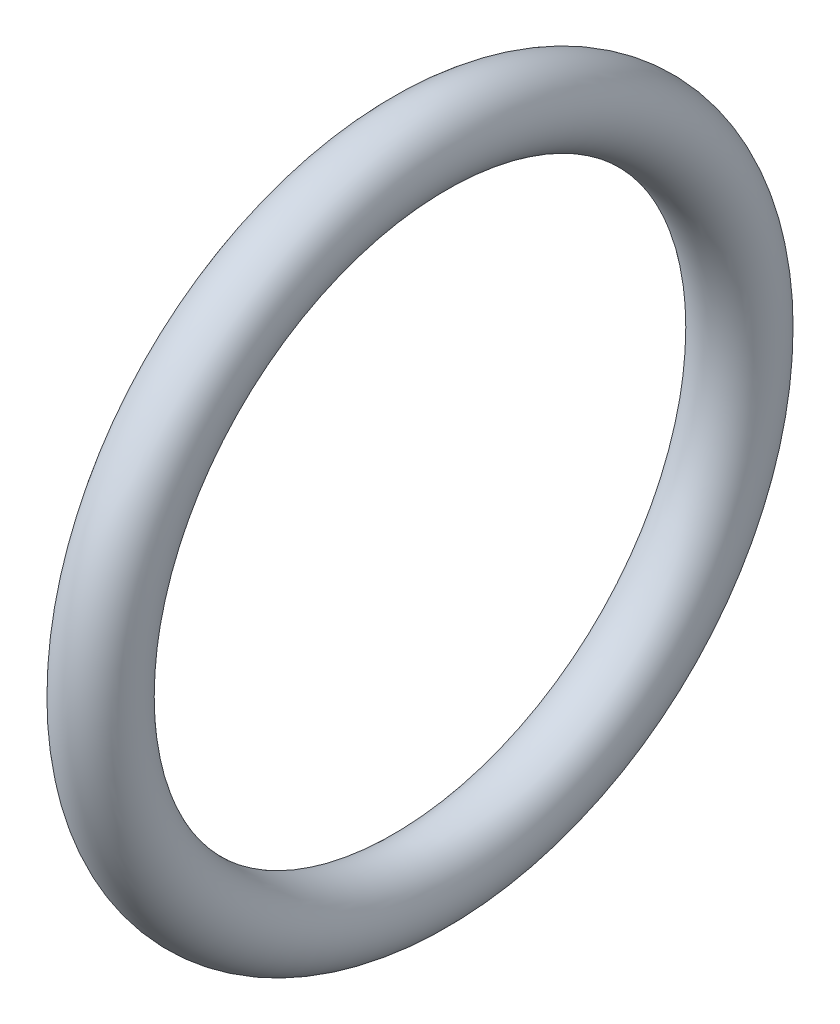
ISO-10303-21;
HEADER;
FILE_DESCRIPTION(('STEP AP214'),'2;1');
FILE_NAME('part.step','',(''),(''),'','','');
FILE_SCHEMA(('AUTOMOTIVE_DESIGN { 1 0 10303 214 1 1 1 1 }'));
ENDSEC;
DATA;
#1=APPLICATION_CONTEXT('core data for automotive mechanical design processes');
#2=APPLICATION_PROTOCOL_DEFINITION('international standard','automotive_design',2000,#1);
#3=PRODUCT_CONTEXT('',#1,'mechanical');
#4=PRODUCT('Part','Part','',(#3));
#5=PRODUCT_RELATED_PRODUCT_CATEGORY('part','',(#4));
#6=PRODUCT_DEFINITION_FORMATION('','',#4);
#7=PRODUCT_DEFINITION_CONTEXT('part definition',#1,'design');
#8=PRODUCT_DEFINITION('design','',#6,#7);
#9=PRODUCT_DEFINITION_SHAPE('','',#8);
#10=(LENGTH_UNIT() NAMED_UNIT(*) SI_UNIT(.MILLI.,.METRE.));
#11=(NAMED_UNIT(*) PLANE_ANGLE_UNIT() SI_UNIT($,.RADIAN.));
#12=(NAMED_UNIT(*) SI_UNIT($,.STERADIAN.) SOLID_ANGLE_UNIT());
#13=UNCERTAINTY_MEASURE_WITH_UNIT(LENGTH_MEASURE(1.E-05),#10,'distance_accuracy_value','');
#14=(GEOMETRIC_REPRESENTATION_CONTEXT(3) GLOBAL_UNCERTAINTY_ASSIGNED_CONTEXT((#13)) GLOBAL_UNIT_ASSIGNED_CONTEXT((#10,
#11,#12)) REPRESENTATION_CONTEXT('',''));
#15=CARTESIAN_POINT('',(0.,0.,0.));
#16=DIRECTION('',(0.,0.,1.));
#17=DIRECTION('',(1.,0.,0.));
#18=AXIS2_PLACEMENT_3D('',#15,#16,#17);
#19=CARTESIAN_POINT('',(0.,0.,0.));
#20=DIRECTION('',(-1.,0.,0.));
#21=DIRECTION('',(0.,0.,1.));
#22=AXIS2_PLACEMENT_3D('',#19,#20,#21);
#23=TOROIDAL_SURFACE('',#22,10.1,1.2);
#24=CARTESIAN_POINT('',(0.,0.,11.3));
#25=VERTEX_POINT('',#24);
#26=VERTEX_LOOP('',#25);
#27=FACE_BOUND('',#26,.T.);
#28=ADVANCED_FACE('F35',(#27),#23,.T.);
#29=CLOSED_SHELL('',(#28));
#30=MANIFOLD_SOLID_BREP('B2',#29);
#31=ADVANCED_BREP_SHAPE_REPRESENTATION('',(#18,#30),#14);
#32=SHAPE_DEFINITION_REPRESENTATION(#9,#31);
ENDSEC;
END-ISO-10303-21;
